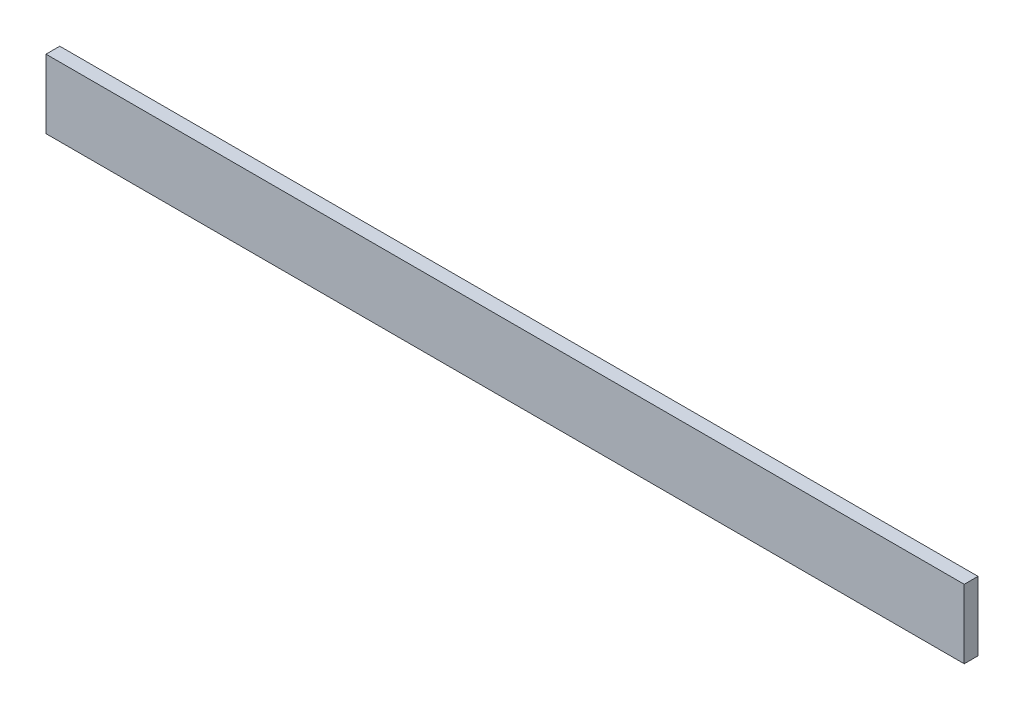
ISO-10303-21;
HEADER;
FILE_DESCRIPTION(('STEP AP214'),'2;1');
FILE_NAME('part.step','',(''),(''),'','','');
FILE_SCHEMA(('AUTOMOTIVE_DESIGN { 1 0 10303 214 1 1 1 1 }'));
ENDSEC;
DATA;
#1=APPLICATION_CONTEXT('core data for automotive mechanical design processes');
#2=APPLICATION_PROTOCOL_DEFINITION('international standard','automotive_design',2000,#1);
#3=PRODUCT_CONTEXT('',#1,'mechanical');
#4=PRODUCT('Part','Part','',(#3));
#5=PRODUCT_RELATED_PRODUCT_CATEGORY('part','',(#4));
#6=PRODUCT_DEFINITION_FORMATION('','',#4);
#7=PRODUCT_DEFINITION_CONTEXT('part definition',#1,'design');
#8=PRODUCT_DEFINITION('design','',#6,#7);
#9=PRODUCT_DEFINITION_SHAPE('','',#8);
#10=(LENGTH_UNIT() NAMED_UNIT(*) SI_UNIT(.MILLI.,.METRE.));
#11=(NAMED_UNIT(*) PLANE_ANGLE_UNIT() SI_UNIT($,.RADIAN.));
#12=(NAMED_UNIT(*) SI_UNIT($,.STERADIAN.) SOLID_ANGLE_UNIT());
#13=UNCERTAINTY_MEASURE_WITH_UNIT(LENGTH_MEASURE(1.E-05),#10,'distance_accuracy_value','');
#14=(GEOMETRIC_REPRESENTATION_CONTEXT(3) GLOBAL_UNCERTAINTY_ASSIGNED_CONTEXT((#13)) GLOBAL_UNIT_ASSIGNED_CONTEXT((#10,
#11,#12)) REPRESENTATION_CONTEXT('',''));
#15=CARTESIAN_POINT('',(0.,0.,0.));
#16=DIRECTION('',(0.,0.,1.));
#17=DIRECTION('',(1.,0.,0.));
#18=AXIS2_PLACEMENT_3D('',#15,#16,#17);
#19=CARTESIAN_POINT('',(0.,0.,15.));
#20=DIRECTION('',(1.,0.,0.));
#21=DIRECTION('',(0.,0.,-1.));
#22=AXIS2_PLACEMENT_3D('',#19,#20,#21);
#23=PLANE('',#22);
#24=DIRECTION('',(0.,-1.,0.));
#25=VECTOR('',#24,1.);
#26=CARTESIAN_POINT('',(0.,0.,0.));
#27=LINE('',#26,#25);
#28=CARTESIAN_POINT('',(0.,75.,0.));
#29=VERTEX_POINT('',#28);
#30=CARTESIAN_POINT('',(0.,0.,0.));
#31=VERTEX_POINT('',#30);
#32=EDGE_CURVE('E107',#29,#31,#27,.T.);
#33=ORIENTED_EDGE('',*,*,#32,.T.);
#34=DIRECTION('',(0.,0.,-1.));
#35=VECTOR('',#34,1.);
#36=CARTESIAN_POINT('',(0.,0.,15.));
#37=LINE('',#36,#35);
#38=CARTESIAN_POINT('',(0.,0.,15.));
#39=VERTEX_POINT('',#38);
#40=EDGE_CURVE('E11',#39,#31,#37,.T.);
#41=ORIENTED_EDGE('',*,*,#40,.F.);
#42=DIRECTION('',(0.,-1.,0.));
#43=VECTOR('',#42,1.);
#44=CARTESIAN_POINT('',(0.,0.,15.));
#45=LINE('',#44,#43);
#46=CARTESIAN_POINT('',(0.,75.,15.));
#47=VERTEX_POINT('',#46);
#48=EDGE_CURVE('E96',#47,#39,#45,.T.);
#49=ORIENTED_EDGE('',*,*,#48,.F.);
#50=DIRECTION('',(0.,0.,-1.));
#51=VECTOR('',#50,1.);
#52=CARTESIAN_POINT('',(0.,75.,15.));
#53=LINE('',#52,#51);
#54=EDGE_CURVE('E102',#47,#29,#53,.T.);
#55=ORIENTED_EDGE('',*,*,#54,.T.);
#56=EDGE_LOOP('',(#33,#41,#49,#55));
#57=FACE_BOUND('',#56,.T.);
#58=ADVANCED_FACE('F44',(#57),#23,.F.);
#59=CARTESIAN_POINT('',(0.,0.,15.));
#60=DIRECTION('',(0.,1.,0.));
#61=DIRECTION('',(0.,0.,1.));
#62=AXIS2_PLACEMENT_3D('',#59,#60,#61);
#63=PLANE('',#62);
#64=DIRECTION('',(1.,0.,0.));
#65=VECTOR('',#64,1.);
#66=CARTESIAN_POINT('',(0.,0.,0.));
#67=LINE('',#66,#65);
#68=CARTESIAN_POINT('',(1000.,0.,0.));
#69=VERTEX_POINT('',#68);
#70=EDGE_CURVE('E99',#31,#69,#67,.T.);
#71=ORIENTED_EDGE('',*,*,#70,.T.);
#72=DIRECTION('',(0.,0.,-1.));
#73=VECTOR('',#72,1.);
#74=CARTESIAN_POINT('',(1000.,0.,15.));
#75=LINE('',#74,#73);
#76=CARTESIAN_POINT('',(1000.,0.,15.));
#77=VERTEX_POINT('',#76);
#78=EDGE_CURVE('E52',#77,#69,#75,.T.);
#79=ORIENTED_EDGE('',*,*,#78,.F.);
#80=DIRECTION('',(1.,0.,0.));
#81=VECTOR('',#80,1.);
#82=CARTESIAN_POINT('',(0.,0.,15.));
#83=LINE('',#82,#81);
#84=EDGE_CURVE('E93',#39,#77,#83,.T.);
#85=ORIENTED_EDGE('',*,*,#84,.F.);
#86=ORIENTED_EDGE('',*,*,#40,.T.);
#87=EDGE_LOOP('',(#71,#79,#85,#86));
#88=FACE_BOUND('',#87,.T.);
#89=ADVANCED_FACE('F97',(#88),#63,.F.);
#90=CARTESIAN_POINT('',(1000.,0.,15.));
#91=DIRECTION('',(-1.,0.,0.));
#92=DIRECTION('',(0.,0.,1.));
#93=AXIS2_PLACEMENT_3D('',#90,#91,#92);
#94=PLANE('',#93);
#95=DIRECTION('',(0.,1.,0.));
#96=VECTOR('',#95,1.);
#97=CARTESIAN_POINT('',(1000.,0.,0.));
#98=LINE('',#97,#96);
#99=CARTESIAN_POINT('',(1000.,75.,0.));
#100=VERTEX_POINT('',#99);
#101=EDGE_CURVE('E79',#69,#100,#98,.T.);
#102=ORIENTED_EDGE('',*,*,#101,.T.);
#103=DIRECTION('',(0.,0.,-1.));
#104=VECTOR('',#103,1.);
#105=CARTESIAN_POINT('',(1000.,75.,15.));
#106=LINE('',#105,#104);
#107=CARTESIAN_POINT('',(1000.,75.,15.));
#108=VERTEX_POINT('',#107);
#109=EDGE_CURVE('E101',#108,#100,#106,.T.);
#110=ORIENTED_EDGE('',*,*,#109,.F.);
#111=DIRECTION('',(0.,1.,0.));
#112=VECTOR('',#111,1.);
#113=CARTESIAN_POINT('',(1000.,0.,15.));
#114=LINE('',#113,#112);
#115=EDGE_CURVE('E94',#77,#108,#114,.T.);
#116=ORIENTED_EDGE('',*,*,#115,.F.);
#117=ORIENTED_EDGE('',*,*,#78,.T.);
#118=EDGE_LOOP('',(#102,#110,#116,#117));
#119=FACE_BOUND('',#118,.T.);
#120=ADVANCED_FACE('F105',(#119),#94,.F.);
#121=CARTESIAN_POINT('',(0.,75.,15.));
#122=DIRECTION('',(0.,-1.,0.));
#123=DIRECTION('',(0.,0.,-1.));
#124=AXIS2_PLACEMENT_3D('',#121,#122,#123);
#125=PLANE('',#124);
#126=DIRECTION('',(-1.,0.,0.));
#127=VECTOR('',#126,1.);
#128=CARTESIAN_POINT('',(0.,75.,0.));
#129=LINE('',#128,#127);
#130=EDGE_CURVE('E81',#100,#29,#129,.T.);
#131=ORIENTED_EDGE('',*,*,#130,.T.);
#132=ORIENTED_EDGE('',*,*,#54,.F.);
#133=DIRECTION('',(-1.,0.,0.));
#134=VECTOR('',#133,1.);
#135=CARTESIAN_POINT('',(0.,75.,15.));
#136=LINE('',#135,#134);
#137=EDGE_CURVE('E62',#108,#47,#136,.T.);
#138=ORIENTED_EDGE('',*,*,#137,.F.);
#139=ORIENTED_EDGE('',*,*,#109,.T.);
#140=EDGE_LOOP('',(#131,#132,#138,#139));
#141=FACE_BOUND('',#140,.T.);
#142=ADVANCED_FACE('F113',(#141),#125,.F.);
#143=CARTESIAN_POINT('',(0.,0.,15.));
#144=DIRECTION('',(0.,0.,-1.));
#145=DIRECTION('',(-1.,0.,0.));
#146=AXIS2_PLACEMENT_3D('',#143,#144,#145);
#147=PLANE('',#146);
#148=ORIENTED_EDGE('',*,*,#48,.T.);
#149=ORIENTED_EDGE('',*,*,#84,.T.);
#150=ORIENTED_EDGE('',*,*,#115,.T.);
#151=ORIENTED_EDGE('',*,*,#137,.T.);
#152=EDGE_LOOP('',(#148,#149,#150,#151));
#153=FACE_BOUND('',#152,.T.);
#154=ADVANCED_FACE('F95',(#153),#147,.F.);
#155=CARTESIAN_POINT('',(0.,0.,0.));
#156=DIRECTION('',(0.,0.,-1.));
#157=DIRECTION('',(-1.,0.,0.));
#158=AXIS2_PLACEMENT_3D('',#155,#156,#157);
#159=PLANE('',#158);
#160=ORIENTED_EDGE('',*,*,#32,.F.);
#161=ORIENTED_EDGE('',*,*,#130,.F.);
#162=ORIENTED_EDGE('',*,*,#101,.F.);
#163=ORIENTED_EDGE('',*,*,#70,.F.);
#164=EDGE_LOOP('',(#160,#161,#162,#163));
#165=FACE_BOUND('',#164,.T.);
#166=ADVANCED_FACE('F119',(#165),#159,.T.);
#167=CLOSED_SHELL('',(#58,#89,#120,#142,#154,#166));
#168=MANIFOLD_SOLID_BREP('B2',#167);
#169=ADVANCED_BREP_SHAPE_REPRESENTATION('',(#18,#168),#14);
#170=SHAPE_DEFINITION_REPRESENTATION(#9,#169);
ENDSEC;
END-ISO-10303-21;
